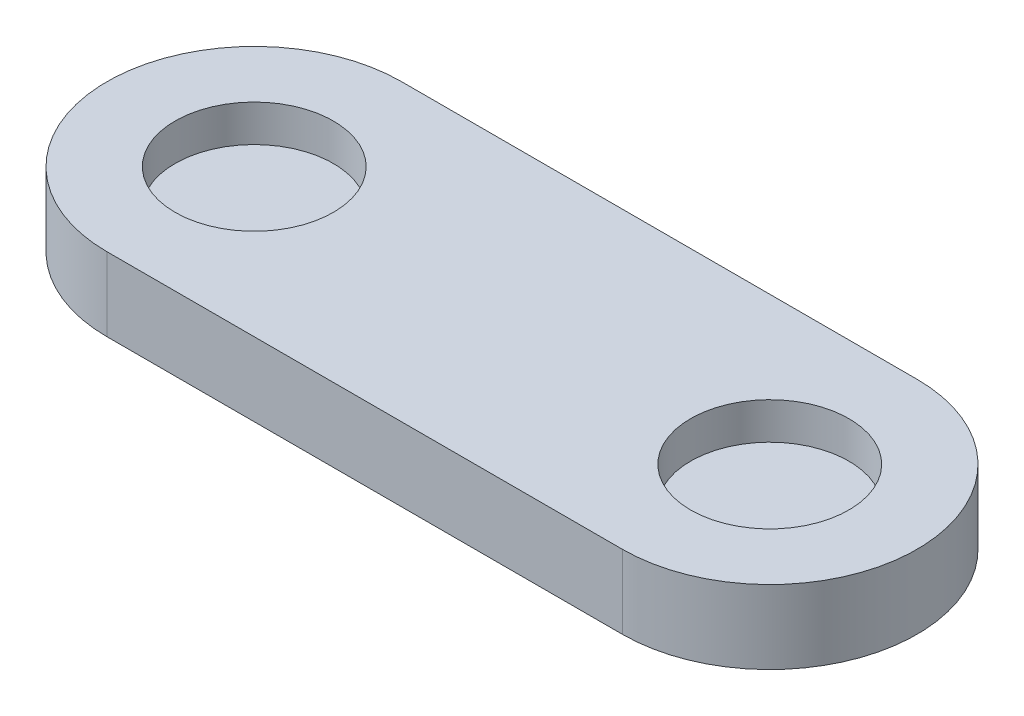
ISO-10303-21;
HEADER;
FILE_DESCRIPTION(('STEP AP214'),'2;1');
FILE_NAME('part.step','',(''),(''),'','','');
FILE_SCHEMA(('AUTOMOTIVE_DESIGN { 1 0 10303 214 1 1 1 1 }'));
ENDSEC;
DATA;
#1=APPLICATION_CONTEXT('core data for automotive mechanical design processes');
#2=APPLICATION_PROTOCOL_DEFINITION('international standard','automotive_design',2000,#1);
#3=PRODUCT_CONTEXT('',#1,'mechanical');
#4=PRODUCT('Part','Part','',(#3));
#5=PRODUCT_RELATED_PRODUCT_CATEGORY('part','',(#4));
#6=PRODUCT_DEFINITION_FORMATION('','',#4);
#7=PRODUCT_DEFINITION_CONTEXT('part definition',#1,'design');
#8=PRODUCT_DEFINITION('design','',#6,#7);
#9=PRODUCT_DEFINITION_SHAPE('','',#8);
#10=(LENGTH_UNIT() NAMED_UNIT(*) SI_UNIT(.MILLI.,.METRE.));
#11=(NAMED_UNIT(*) PLANE_ANGLE_UNIT() SI_UNIT($,.RADIAN.));
#12=(NAMED_UNIT(*) SI_UNIT($,.STERADIAN.) SOLID_ANGLE_UNIT());
#13=UNCERTAINTY_MEASURE_WITH_UNIT(LENGTH_MEASURE(1.E-05),#10,'distance_accuracy_value','');
#14=(GEOMETRIC_REPRESENTATION_CONTEXT(3) GLOBAL_UNCERTAINTY_ASSIGNED_CONTEXT((#13)) GLOBAL_UNIT_ASSIGNED_CONTEXT((#10,
#11,#12)) REPRESENTATION_CONTEXT('',''));
#15=CARTESIAN_POINT('',(0.,0.,0.));
#16=DIRECTION('',(0.,0.,1.));
#17=DIRECTION('',(1.,0.,0.));
#18=AXIS2_PLACEMENT_3D('',#15,#16,#17);
#19=CARTESIAN_POINT('',(8.89,1.27,0.));
#20=DIRECTION('',(0.,1.,0.));
#21=DIRECTION('',(0.,0.,1.));
#22=AXIS2_PLACEMENT_3D('',#19,#20,#21);
#23=PLANE('',#22);
#24=CARTESIAN_POINT('',(-8.89,1.27,0.));
#25=DIRECTION('',(0.,1.,0.));
#26=DIRECTION('',(0.,0.,1.));
#27=AXIS2_PLACEMENT_3D('',#24,#25,#26);
#28=CIRCLE('',#27,2.7305);
#29=CARTESIAN_POINT('',(-8.89,1.27,2.7305));
#30=VERTEX_POINT('',#29);
#31=EDGE_CURVE('E111',#30,#30,#28,.T.);
#32=ORIENTED_EDGE('',*,*,#31,.F.);
#33=EDGE_LOOP('',(#32));
#34=FACE_BOUND('',#33,.T.);
#35=CARTESIAN_POINT('',(8.89,1.27,0.));
#36=DIRECTION('',(0.,1.,0.));
#37=DIRECTION('',(0.,0.,1.));
#38=AXIS2_PLACEMENT_3D('',#35,#36,#37);
#39=CIRCLE('',#38,5.08);
#40=CARTESIAN_POINT('',(8.89,1.27,5.08));
#41=VERTEX_POINT('',#40);
#42=CARTESIAN_POINT('',(8.89,1.27,-5.08));
#43=VERTEX_POINT('',#42);
#44=EDGE_CURVE('E84',#41,#43,#39,.T.);
#45=ORIENTED_EDGE('',*,*,#44,.T.);
#46=DIRECTION('',(-1.,0.,0.));
#47=VECTOR('',#46,1.);
#48=CARTESIAN_POINT('',(8.89,1.27,-5.08));
#49=LINE('',#48,#47);
#50=CARTESIAN_POINT('',(-8.89,1.27,-5.08));
#51=VERTEX_POINT('',#50);
#52=EDGE_CURVE('E117',#43,#51,#49,.T.);
#53=ORIENTED_EDGE('',*,*,#52,.T.);
#54=CARTESIAN_POINT('',(-8.89,1.27,0.));
#55=DIRECTION('',(0.,1.,0.));
#56=DIRECTION('',(0.,0.,1.));
#57=AXIS2_PLACEMENT_3D('',#54,#55,#56);
#58=CIRCLE('',#57,5.08);
#59=CARTESIAN_POINT('',(-8.89,1.27,5.08));
#60=VERTEX_POINT('',#59);
#61=EDGE_CURVE('E59',#51,#60,#58,.T.);
#62=ORIENTED_EDGE('',*,*,#61,.T.);
#63=DIRECTION('',(1.,0.,0.));
#64=VECTOR('',#63,1.);
#65=CARTESIAN_POINT('',(8.89,1.27,5.08));
#66=LINE('',#65,#64);
#67=EDGE_CURVE('E54',#60,#41,#66,.T.);
#68=ORIENTED_EDGE('',*,*,#67,.T.);
#69=EDGE_LOOP('',(#45,#53,#62,#68));
#70=FACE_BOUND('',#69,.T.);
#71=CARTESIAN_POINT('',(8.89,1.27,0.));
#72=DIRECTION('',(0.,1.,0.));
#73=DIRECTION('',(0.,0.,1.));
#74=AXIS2_PLACEMENT_3D('',#71,#72,#73);
#75=CIRCLE('',#74,2.7305);
#76=CARTESIAN_POINT('',(8.89,1.27,2.7305));
#77=VERTEX_POINT('',#76);
#78=EDGE_CURVE('E105',#77,#77,#75,.T.);
#79=ORIENTED_EDGE('',*,*,#78,.F.);
#80=EDGE_LOOP('',(#79));
#81=FACE_BOUND('',#80,.T.);
#82=ADVANCED_FACE('F39',(#34,#70,#81),#23,.T.);
#83=CARTESIAN_POINT('',(8.89,1.27,0.));
#84=DIRECTION('',(0.,-1.,0.));
#85=DIRECTION('',(0.,0.,-1.));
#86=AXIS2_PLACEMENT_3D('',#83,#84,#85);
#87=CYLINDRICAL_SURFACE('',#86,5.08);
#88=DIRECTION('',(0.,-1.,0.));
#89=VECTOR('',#88,1.);
#90=CARTESIAN_POINT('',(8.89,1.27,5.08));
#91=LINE('',#90,#89);
#92=CARTESIAN_POINT('',(8.89,-1.27,5.08));
#93=VERTEX_POINT('',#92);
#94=EDGE_CURVE('E79',#41,#93,#91,.T.);
#95=ORIENTED_EDGE('',*,*,#94,.T.);
#96=CARTESIAN_POINT('',(8.89,-1.27,0.));
#97=DIRECTION('',(0.,-1.,0.));
#98=DIRECTION('',(0.,0.,-1.));
#99=AXIS2_PLACEMENT_3D('',#96,#97,#98);
#100=CIRCLE('',#99,5.08);
#101=CARTESIAN_POINT('',(8.89,-1.27,-5.08));
#102=VERTEX_POINT('',#101);
#103=EDGE_CURVE('E83',#102,#93,#100,.T.);
#104=ORIENTED_EDGE('',*,*,#103,.F.);
#105=DIRECTION('',(0.,-1.,0.));
#106=VECTOR('',#105,1.);
#107=CARTESIAN_POINT('',(8.89,1.27,-5.08));
#108=LINE('',#107,#106);
#109=EDGE_CURVE('E11',#43,#102,#108,.T.);
#110=ORIENTED_EDGE('',*,*,#109,.F.);
#111=ORIENTED_EDGE('',*,*,#44,.F.);
#112=EDGE_LOOP('',(#95,#104,#110,#111));
#113=FACE_BOUND('',#112,.T.);
#114=ADVANCED_FACE('F41',(#113),#87,.T.);
#115=CARTESIAN_POINT('',(8.89,1.27,-5.08));
#116=DIRECTION('',(0.,0.,1.));
#117=DIRECTION('',(1.,0.,0.));
#118=AXIS2_PLACEMENT_3D('',#115,#116,#117);
#119=PLANE('',#118);
#120=ORIENTED_EDGE('',*,*,#109,.T.);
#121=DIRECTION('',(1.,0.,0.));
#122=VECTOR('',#121,1.);
#123=CARTESIAN_POINT('',(-8.89,-1.27,-5.08));
#124=LINE('',#123,#122);
#125=CARTESIAN_POINT('',(-8.89,-1.27,-5.08));
#126=VERTEX_POINT('',#125);
#127=EDGE_CURVE('E99',#126,#102,#124,.T.);
#128=ORIENTED_EDGE('',*,*,#127,.F.);
#129=DIRECTION('',(0.,-1.,0.));
#130=VECTOR('',#129,1.);
#131=CARTESIAN_POINT('',(-8.89,1.27,-5.08));
#132=LINE('',#131,#130);
#133=EDGE_CURVE('E47',#51,#126,#132,.T.);
#134=ORIENTED_EDGE('',*,*,#133,.F.);
#135=ORIENTED_EDGE('',*,*,#52,.F.);
#136=EDGE_LOOP('',(#120,#128,#134,#135));
#137=FACE_BOUND('',#136,.T.);
#138=ADVANCED_FACE('F125',(#137),#119,.F.);
#139=CARTESIAN_POINT('',(-8.89,1.27,0.));
#140=DIRECTION('',(0.,-1.,0.));
#141=DIRECTION('',(0.,0.,-1.));
#142=AXIS2_PLACEMENT_3D('',#139,#140,#141);
#143=CYLINDRICAL_SURFACE('',#142,5.08);
#144=ORIENTED_EDGE('',*,*,#133,.T.);
#145=CARTESIAN_POINT('',(-8.89,-1.27,0.));
#146=DIRECTION('',(0.,-1.,0.));
#147=DIRECTION('',(0.,0.,-1.));
#148=AXIS2_PLACEMENT_3D('',#145,#146,#147);
#149=CIRCLE('',#148,5.08);
#150=CARTESIAN_POINT('',(-8.89,-1.27,5.08));
#151=VERTEX_POINT('',#150);
#152=EDGE_CURVE('E94',#151,#126,#149,.T.);
#153=ORIENTED_EDGE('',*,*,#152,.F.);
#154=DIRECTION('',(0.,-1.,0.));
#155=VECTOR('',#154,1.);
#156=CARTESIAN_POINT('',(-8.89,1.27,5.08));
#157=LINE('',#156,#155);
#158=EDGE_CURVE('E86',#60,#151,#157,.T.);
#159=ORIENTED_EDGE('',*,*,#158,.F.);
#160=ORIENTED_EDGE('',*,*,#61,.F.);
#161=EDGE_LOOP('',(#144,#153,#159,#160));
#162=FACE_BOUND('',#161,.T.);
#163=ADVANCED_FACE('F123',(#162),#143,.T.);
#164=CARTESIAN_POINT('',(8.89,1.27,5.08));
#165=DIRECTION('',(0.,0.,-1.));
#166=DIRECTION('',(-1.,0.,0.));
#167=AXIS2_PLACEMENT_3D('',#164,#165,#166);
#168=PLANE('',#167);
#169=ORIENTED_EDGE('',*,*,#158,.T.);
#170=DIRECTION('',(-1.,0.,0.));
#171=VECTOR('',#170,1.);
#172=CARTESIAN_POINT('',(8.89,-1.27,5.08));
#173=LINE('',#172,#171);
#174=EDGE_CURVE('E89',#93,#151,#173,.T.);
#175=ORIENTED_EDGE('',*,*,#174,.F.);
#176=ORIENTED_EDGE('',*,*,#94,.F.);
#177=ORIENTED_EDGE('',*,*,#67,.F.);
#178=EDGE_LOOP('',(#169,#175,#176,#177));
#179=FACE_BOUND('',#178,.T.);
#180=ADVANCED_FACE('F90',(#179),#168,.F.);
#181=CARTESIAN_POINT('',(-8.89,1.27,0.));
#182=DIRECTION('',(0.,-1.,0.));
#183=DIRECTION('',(0.,0.,-1.));
#184=AXIS2_PLACEMENT_3D('',#181,#182,#183);
#185=CYLINDRICAL_SURFACE('',#184,2.7305);
#186=ORIENTED_EDGE('',*,*,#31,.T.);
#187=EDGE_LOOP('',(#186));
#188=FACE_BOUND('',#187,.T.);
#189=CARTESIAN_POINT('',(-8.89,0.,0.));
#190=DIRECTION('',(0.,1.,0.));
#191=DIRECTION('',(0.,0.,1.));
#192=AXIS2_PLACEMENT_3D('',#189,#190,#191);
#193=CIRCLE('',#192,2.7305);
#194=CARTESIAN_POINT('',(-8.89,0.,2.7305));
#195=VERTEX_POINT('',#194);
#196=EDGE_CURVE('E108',#195,#195,#193,.T.);
#197=ORIENTED_EDGE('',*,*,#196,.F.);
#198=EDGE_LOOP('',(#197));
#199=FACE_BOUND('',#198,.T.);
#200=ADVANCED_FACE('F136',(#188,#199),#185,.F.);
#201=CARTESIAN_POINT('',(8.89,1.27,0.));
#202=DIRECTION('',(0.,-1.,0.));
#203=DIRECTION('',(0.,0.,-1.));
#204=AXIS2_PLACEMENT_3D('',#201,#202,#203);
#205=CYLINDRICAL_SURFACE('',#204,2.7305);
#206=ORIENTED_EDGE('',*,*,#78,.T.);
#207=EDGE_LOOP('',(#206));
#208=FACE_BOUND('',#207,.T.);
#209=CARTESIAN_POINT('',(8.89,0.,0.));
#210=DIRECTION('',(0.,1.,0.));
#211=DIRECTION('',(0.,0.,1.));
#212=AXIS2_PLACEMENT_3D('',#209,#210,#211);
#213=CIRCLE('',#212,2.7305);
#214=CARTESIAN_POINT('',(8.89,0.,2.7305));
#215=VERTEX_POINT('',#214);
#216=EDGE_CURVE('E104',#215,#215,#213,.T.);
#217=ORIENTED_EDGE('',*,*,#216,.F.);
#218=EDGE_LOOP('',(#217));
#219=FACE_BOUND('',#218,.T.);
#220=ADVANCED_FACE('F132',(#208,#219),#205,.F.);
#221=CARTESIAN_POINT('',(8.89,0.,0.));
#222=DIRECTION('',(0.,-1.,0.));
#223=DIRECTION('',(0.,0.,-1.));
#224=AXIS2_PLACEMENT_3D('',#221,#222,#223);
#225=PLANE('',#224);
#226=ORIENTED_EDGE('',*,*,#216,.T.);
#227=EDGE_LOOP('',(#226));
#228=FACE_BOUND('',#227,.T.);
#229=ADVANCED_FACE('F135',(#228),#225,.F.);
#230=ORIENTED_EDGE('',*,*,#196,.T.);
#231=EDGE_LOOP('',(#230));
#232=FACE_BOUND('',#231,.T.);
#233=ADVANCED_FACE('F141',(#232),#225,.F.);
#234=CARTESIAN_POINT('',(8.89,-1.27,0.));
#235=DIRECTION('',(0.,-1.,0.));
#236=DIRECTION('',(0.,0.,-1.));
#237=AXIS2_PLACEMENT_3D('',#234,#235,#236);
#238=PLANE('',#237);
#239=ORIENTED_EDGE('',*,*,#103,.T.);
#240=ORIENTED_EDGE('',*,*,#174,.T.);
#241=ORIENTED_EDGE('',*,*,#152,.T.);
#242=ORIENTED_EDGE('',*,*,#127,.T.);
#243=EDGE_LOOP('',(#239,#240,#241,#242));
#244=FACE_BOUND('',#243,.T.);
#245=ADVANCED_FACE('F97',(#244),#238,.T.);
#246=CLOSED_SHELL('',(#82,#114,#138,#163,#180,#200,#220,#229,#233,#245));
#247=MANIFOLD_SOLID_BREP('B2',#246);
#248=ADVANCED_BREP_SHAPE_REPRESENTATION('',(#18,#247),#14);
#249=SHAPE_DEFINITION_REPRESENTATION(#9,#248);
ENDSEC;
END-ISO-10303-21;
